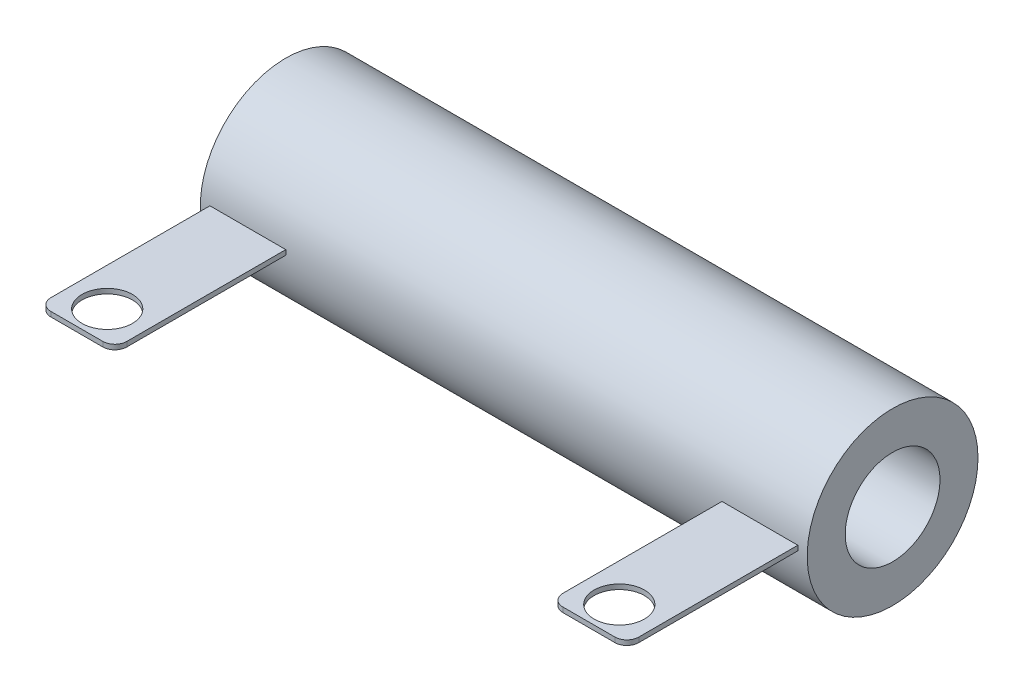
ISO-10303-21;
HEADER;
FILE_DESCRIPTION(('STEP AP214'),'2;1');
FILE_NAME('part.step','',(''),(''),'','','');
FILE_SCHEMA(('AUTOMOTIVE_DESIGN { 1 0 10303 214 1 1 1 1 }'));
ENDSEC;
DATA;
#1=APPLICATION_CONTEXT('core data for automotive mechanical design processes');
#2=APPLICATION_PROTOCOL_DEFINITION('international standard','automotive_design',2000,#1);
#3=PRODUCT_CONTEXT('',#1,'mechanical');
#4=PRODUCT('Part','Part','',(#3));
#5=PRODUCT_RELATED_PRODUCT_CATEGORY('part','',(#4));
#6=PRODUCT_DEFINITION_FORMATION('','',#4);
#7=PRODUCT_DEFINITION_CONTEXT('part definition',#1,'design');
#8=PRODUCT_DEFINITION('design','',#6,#7);
#9=PRODUCT_DEFINITION_SHAPE('','',#8);
#10=(LENGTH_UNIT() NAMED_UNIT(*) SI_UNIT(.MILLI.,.METRE.));
#11=(NAMED_UNIT(*) PLANE_ANGLE_UNIT() SI_UNIT($,.RADIAN.));
#12=(NAMED_UNIT(*) SI_UNIT($,.STERADIAN.) SOLID_ANGLE_UNIT());
#13=UNCERTAINTY_MEASURE_WITH_UNIT(LENGTH_MEASURE(1.E-05),#10,'distance_accuracy_value','');
#14=(GEOMETRIC_REPRESENTATION_CONTEXT(3) GLOBAL_UNCERTAINTY_ASSIGNED_CONTEXT((#13)) GLOBAL_UNIT_ASSIGNED_CONTEXT((#10,
#11,#12)) REPRESENTATION_CONTEXT('',''));
#15=CARTESIAN_POINT('',(0.,0.,0.));
#16=DIRECTION('',(0.,0.,1.));
#17=DIRECTION('',(1.,0.,0.));
#18=AXIS2_PLACEMENT_3D('',#15,#16,#17);
#19=CARTESIAN_POINT('',(23.606,0.407,20.45));
#20=DIRECTION('',(0.,-1.,0.));
#21=DIRECTION('',(0.,0.,-1.));
#22=AXIS2_PLACEMENT_3D('',#19,#20,#21);
#23=PLANE('',#22);
#24=CARTESIAN_POINT('',(23.606,0.407,20.45));
#25=DIRECTION('',(0.,1.,0.));
#26=DIRECTION('',(0.,0.,-1.));
#27=AXIS2_PLACEMENT_3D('',#24,#25,#26);
#28=CIRCLE('',#27,1.);
#29=CARTESIAN_POINT('',(23.606,0.407,21.45));
#30=VERTEX_POINT('',#29);
#31=CARTESIAN_POINT('',(24.606,0.407,20.45));
#32=VERTEX_POINT('',#31);
#33=EDGE_CURVE('E146',#30,#32,#28,.T.);
#34=ORIENTED_EDGE('',*,*,#33,.T.);
#35=DIRECTION('',(0.,0.,-1.));
#36=VECTOR('',#35,1.);
#37=CARTESIAN_POINT('',(24.606,0.407,5.19404127035727));
#38=LINE('',#37,#36);
#39=CARTESIAN_POINT('',(24.606,0.407,5.19404127035727));
#40=VERTEX_POINT('',#39);
#41=EDGE_CURVE('E104',#32,#40,#38,.T.);
#42=ORIENTED_EDGE('',*,*,#41,.T.);
#43=DIRECTION('',(-1.,0.,0.));
#44=VECTOR('',#43,1.);
#45=CARTESIAN_POINT('',(24.606,0.407,5.19404127035727));
#46=LINE('',#45,#44);
#47=CARTESIAN_POINT('',(18.256,0.407,5.19404127035727));
#48=VERTEX_POINT('',#47);
#49=EDGE_CURVE('E117',#40,#48,#46,.T.);
#50=ORIENTED_EDGE('',*,*,#49,.T.);
#51=DIRECTION('',(0.,0.,1.));
#52=VECTOR('',#51,1.);
#53=CARTESIAN_POINT('',(18.256,0.407,5.19404127035727));
#54=LINE('',#53,#52);
#55=CARTESIAN_POINT('',(18.256,0.407,20.45));
#56=VERTEX_POINT('',#55);
#57=EDGE_CURVE('E111',#48,#56,#54,.T.);
#58=ORIENTED_EDGE('',*,*,#57,.T.);
#59=CARTESIAN_POINT('',(19.256,0.407,20.45));
#60=DIRECTION('',(0.,1.,0.));
#61=DIRECTION('',(0.,0.,-1.));
#62=AXIS2_PLACEMENT_3D('',#59,#60,#61);
#63=CIRCLE('',#62,1.);
#64=CARTESIAN_POINT('',(19.256,0.407,21.45));
#65=VERTEX_POINT('',#64);
#66=EDGE_CURVE('E115',#56,#65,#63,.T.);
#67=ORIENTED_EDGE('',*,*,#66,.T.);
#68=DIRECTION('',(1.,0.,0.));
#69=VECTOR('',#68,1.);
#70=CARTESIAN_POINT('',(23.606,0.407,21.45));
#71=LINE('',#70,#69);
#72=EDGE_CURVE('E67',#65,#30,#71,.T.);
#73=ORIENTED_EDGE('',*,*,#72,.T.);
#74=EDGE_LOOP('',(#34,#42,#50,#58,#67,#73));
#75=FACE_BOUND('',#74,.T.);
#76=CARTESIAN_POINT('',(21.431,0.407,18.91));
#77=DIRECTION('',(0.,1.,0.));
#78=DIRECTION('',(0.,0.,-1.));
#79=AXIS2_PLACEMENT_3D('',#76,#77,#78);
#80=CIRCLE('',#79,2.1085);
#81=CARTESIAN_POINT('',(21.431,0.407,16.8015));
#82=VERTEX_POINT('',#81);
#83=EDGE_CURVE('E139',#82,#82,#80,.T.);
#84=ORIENTED_EDGE('',*,*,#83,.F.);
#85=EDGE_LOOP('',(#84));
#86=FACE_BOUND('',#85,.T.);
#87=ADVANCED_FACE('F50',(#75,#86),#23,.F.);
#88=CARTESIAN_POINT('',(23.606,0.,20.45));
#89=DIRECTION('',(0.,-1.,0.));
#90=DIRECTION('',(0.,0.,-1.));
#91=AXIS2_PLACEMENT_3D('',#88,#89,#90);
#92=PLANE('',#91);
#93=CARTESIAN_POINT('',(23.606,0.,20.45));
#94=DIRECTION('',(0.,1.,0.));
#95=DIRECTION('',(0.,0.,-1.));
#96=AXIS2_PLACEMENT_3D('',#93,#94,#95);
#97=CIRCLE('',#96,1.);
#98=CARTESIAN_POINT('',(23.606,0.,21.45));
#99=VERTEX_POINT('',#98);
#100=CARTESIAN_POINT('',(24.606,0.,20.45));
#101=VERTEX_POINT('',#100);
#102=EDGE_CURVE('E135',#99,#101,#97,.T.);
#103=ORIENTED_EDGE('',*,*,#102,.F.);
#104=DIRECTION('',(1.,0.,0.));
#105=VECTOR('',#104,1.);
#106=CARTESIAN_POINT('',(23.606,0.,21.45));
#107=LINE('',#106,#105);
#108=CARTESIAN_POINT('',(19.256,0.,21.45));
#109=VERTEX_POINT('',#108);
#110=EDGE_CURVE('E96',#109,#99,#107,.T.);
#111=ORIENTED_EDGE('',*,*,#110,.F.);
#112=CARTESIAN_POINT('',(19.256,0.,20.45));
#113=DIRECTION('',(0.,1.,0.));
#114=DIRECTION('',(0.,0.,-1.));
#115=AXIS2_PLACEMENT_3D('',#112,#113,#114);
#116=CIRCLE('',#115,1.);
#117=CARTESIAN_POINT('',(18.256,0.,20.45));
#118=VERTEX_POINT('',#117);
#119=EDGE_CURVE('E90',#118,#109,#116,.T.);
#120=ORIENTED_EDGE('',*,*,#119,.F.);
#121=DIRECTION('',(0.,0.,1.));
#122=VECTOR('',#121,1.);
#123=CARTESIAN_POINT('',(18.256,0.,5.19404127035727));
#124=LINE('',#123,#122);
#125=CARTESIAN_POINT('',(18.256,0.,5.19404127035727));
#126=VERTEX_POINT('',#125);
#127=EDGE_CURVE('E125',#126,#118,#124,.T.);
#128=ORIENTED_EDGE('',*,*,#127,.F.);
#129=DIRECTION('',(-1.,0.,0.));
#130=VECTOR('',#129,1.);
#131=CARTESIAN_POINT('',(24.606,0.,5.19404127035727));
#132=LINE('',#131,#130);
#133=CARTESIAN_POINT('',(24.606,0.,5.19404127035727));
#134=VERTEX_POINT('',#133);
#135=EDGE_CURVE('E141',#134,#126,#132,.T.);
#136=ORIENTED_EDGE('',*,*,#135,.F.);
#137=DIRECTION('',(0.,0.,-1.));
#138=VECTOR('',#137,1.);
#139=CARTESIAN_POINT('',(24.606,0.,5.19404127035727));
#140=LINE('',#139,#138);
#141=EDGE_CURVE('E138',#101,#134,#140,.T.);
#142=ORIENTED_EDGE('',*,*,#141,.F.);
#143=EDGE_LOOP('',(#103,#111,#120,#128,#136,#142));
#144=FACE_BOUND('',#143,.T.);
#145=CARTESIAN_POINT('',(21.431,0.,18.91));
#146=DIRECTION('',(0.,1.,0.));
#147=DIRECTION('',(0.,0.,-1.));
#148=AXIS2_PLACEMENT_3D('',#145,#146,#147);
#149=CIRCLE('',#148,2.1085);
#150=CARTESIAN_POINT('',(21.431,0.,16.8015));
#151=VERTEX_POINT('',#150);
#152=EDGE_CURVE('E239',#151,#151,#149,.T.);
#153=ORIENTED_EDGE('',*,*,#152,.T.);
#154=EDGE_LOOP('',(#153));
#155=FACE_BOUND('',#154,.T.);
#156=ADVANCED_FACE('F155',(#144,#155),#92,.T.);
#157=CARTESIAN_POINT('',(23.606,0.407,20.45));
#158=DIRECTION('',(0.,-1.,0.));
#159=DIRECTION('',(0.,0.,-1.));
#160=AXIS2_PLACEMENT_3D('',#157,#158,#159);
#161=CYLINDRICAL_SURFACE('',#160,1.);
#162=ORIENTED_EDGE('',*,*,#102,.T.);
#163=DIRECTION('',(0.,-1.,0.));
#164=VECTOR('',#163,1.);
#165=CARTESIAN_POINT('',(24.606,0.407,20.45));
#166=LINE('',#165,#164);
#167=EDGE_CURVE('E12',#32,#101,#166,.T.);
#168=ORIENTED_EDGE('',*,*,#167,.F.);
#169=ORIENTED_EDGE('',*,*,#33,.F.);
#170=DIRECTION('',(0.,-1.,0.));
#171=VECTOR('',#170,1.);
#172=CARTESIAN_POINT('',(23.606,0.407,21.45));
#173=LINE('',#172,#171);
#174=EDGE_CURVE('E131',#30,#99,#173,.T.);
#175=ORIENTED_EDGE('',*,*,#174,.T.);
#176=EDGE_LOOP('',(#162,#168,#169,#175));
#177=FACE_BOUND('',#176,.T.);
#178=ADVANCED_FACE('F52',(#177),#161,.T.);
#179=CARTESIAN_POINT('',(24.606,0.407,5.19404127035727));
#180=DIRECTION('',(-1.,0.,0.));
#181=DIRECTION('',(0.,0.,1.));
#182=AXIS2_PLACEMENT_3D('',#179,#180,#181);
#183=PLANE('',#182);
#184=ORIENTED_EDGE('',*,*,#141,.T.);
#185=DIRECTION('',(0.,-1.,0.));
#186=VECTOR('',#185,1.);
#187=CARTESIAN_POINT('',(24.606,0.407,5.19404127035727));
#188=LINE('',#187,#186);
#189=EDGE_CURVE('E59',#40,#134,#188,.T.);
#190=ORIENTED_EDGE('',*,*,#189,.F.);
#191=ORIENTED_EDGE('',*,*,#41,.F.);
#192=ORIENTED_EDGE('',*,*,#167,.T.);
#193=EDGE_LOOP('',(#184,#190,#191,#192));
#194=FACE_BOUND('',#193,.T.);
#195=ADVANCED_FACE('F180',(#194),#183,.F.);
#196=CARTESIAN_POINT('',(24.606,0.407,5.19404127035727));
#197=DIRECTION('',(0.,0.,1.));
#198=DIRECTION('',(1.,0.,0.));
#199=AXIS2_PLACEMENT_3D('',#196,#197,#198);
#200=PLANE('',#199);
#201=ORIENTED_EDGE('',*,*,#135,.T.);
#202=DIRECTION('',(0.,-1.,0.));
#203=VECTOR('',#202,1.);
#204=CARTESIAN_POINT('',(18.256,0.407,5.19404127035727));
#205=LINE('',#204,#203);
#206=EDGE_CURVE('E126',#48,#126,#205,.T.);
#207=ORIENTED_EDGE('',*,*,#206,.F.);
#208=ORIENTED_EDGE('',*,*,#49,.F.);
#209=ORIENTED_EDGE('',*,*,#189,.T.);
#210=EDGE_LOOP('',(#201,#207,#208,#209));
#211=FACE_BOUND('',#210,.T.);
#212=ADVANCED_FACE('F152',(#211),#200,.F.);
#213=CARTESIAN_POINT('',(18.256,0.407,5.19404127035727));
#214=DIRECTION('',(1.,0.,0.));
#215=DIRECTION('',(0.,0.,-1.));
#216=AXIS2_PLACEMENT_3D('',#213,#214,#215);
#217=PLANE('',#216);
#218=ORIENTED_EDGE('',*,*,#127,.T.);
#219=DIRECTION('',(0.,-1.,0.));
#220=VECTOR('',#219,1.);
#221=CARTESIAN_POINT('',(18.256,0.407,20.45));
#222=LINE('',#221,#220);
#223=EDGE_CURVE('E122',#56,#118,#222,.T.);
#224=ORIENTED_EDGE('',*,*,#223,.F.);
#225=ORIENTED_EDGE('',*,*,#57,.F.);
#226=ORIENTED_EDGE('',*,*,#206,.T.);
#227=EDGE_LOOP('',(#218,#224,#225,#226));
#228=FACE_BOUND('',#227,.T.);
#229=ADVANCED_FACE('F123',(#228),#217,.F.);
#230=CARTESIAN_POINT('',(19.256,0.407,20.45));
#231=DIRECTION('',(0.,-1.,0.));
#232=DIRECTION('',(0.,0.,-1.));
#233=AXIS2_PLACEMENT_3D('',#230,#231,#232);
#234=CYLINDRICAL_SURFACE('',#233,1.);
#235=ORIENTED_EDGE('',*,*,#119,.T.);
#236=DIRECTION('',(0.,-1.,0.));
#237=VECTOR('',#236,1.);
#238=CARTESIAN_POINT('',(19.256,0.407,21.45));
#239=LINE('',#238,#237);
#240=EDGE_CURVE('E127',#65,#109,#239,.T.);
#241=ORIENTED_EDGE('',*,*,#240,.F.);
#242=ORIENTED_EDGE('',*,*,#66,.F.);
#243=ORIENTED_EDGE('',*,*,#223,.T.);
#244=EDGE_LOOP('',(#235,#241,#242,#243));
#245=FACE_BOUND('',#244,.T.);
#246=ADVANCED_FACE('F129',(#245),#234,.T.);
#247=CARTESIAN_POINT('',(23.606,0.407,21.45));
#248=DIRECTION('',(0.,0.,-1.));
#249=DIRECTION('',(-1.,0.,0.));
#250=AXIS2_PLACEMENT_3D('',#247,#248,#249);
#251=PLANE('',#250);
#252=ORIENTED_EDGE('',*,*,#110,.T.);
#253=ORIENTED_EDGE('',*,*,#174,.F.);
#254=ORIENTED_EDGE('',*,*,#72,.F.);
#255=ORIENTED_EDGE('',*,*,#240,.T.);
#256=EDGE_LOOP('',(#252,#253,#254,#255));
#257=FACE_BOUND('',#256,.T.);
#258=ADVANCED_FACE('F160',(#257),#251,.F.);
#259=CARTESIAN_POINT('',(21.431,0.407,18.91));
#260=DIRECTION('',(0.,-1.,0.));
#261=DIRECTION('',(0.,0.,-1.));
#262=AXIS2_PLACEMENT_3D('',#259,#260,#261);
#263=CYLINDRICAL_SURFACE('',#262,2.1085);
#264=ORIENTED_EDGE('',*,*,#83,.T.);
#265=EDGE_LOOP('',(#264));
#266=FACE_BOUND('',#265,.T.);
#267=ORIENTED_EDGE('',*,*,#152,.F.);
#268=EDGE_LOOP('',(#267));
#269=FACE_BOUND('',#268,.T.);
#270=ADVANCED_FACE('F162',(#266,#269),#263,.F.);
#271=CLOSED_SHELL('',(#87,#156,#178,#195,#212,#229,#246,#258,#270));
#272=MANIFOLD_SOLID_BREP('B2',#271);
#273=CARTESIAN_POINT('',(-23.606,0.407,20.45));
#274=DIRECTION('',(0.,1.,0.));
#275=DIRECTION('',(0.,0.,1.));
#276=AXIS2_PLACEMENT_3D('',#273,#274,#275);
#277=PLANE('',#276);
#278=DIRECTION('',(0.,0.,1.));
#279=VECTOR('',#278,1.);
#280=CARTESIAN_POINT('',(-24.606,0.407,5.19404127035727));
#281=LINE('',#280,#279);
#282=CARTESIAN_POINT('',(-24.606,0.407,5.19404127035727));
#283=VERTEX_POINT('',#282);
#284=CARTESIAN_POINT('',(-24.606,0.407,20.45));
#285=VERTEX_POINT('',#284);
#286=EDGE_CURVE('E353',#283,#285,#281,.T.);
#287=ORIENTED_EDGE('',*,*,#286,.T.);
#288=CARTESIAN_POINT('',(-23.606,0.407,20.45));
#289=DIRECTION('',(0.,1.,0.));
#290=DIRECTION('',(0.,0.,1.));
#291=AXIS2_PLACEMENT_3D('',#288,#289,#290);
#292=CIRCLE('',#291,1.);
#293=CARTESIAN_POINT('',(-23.606,0.407,21.45));
#294=VERTEX_POINT('',#293);
#295=EDGE_CURVE('E308',#285,#294,#292,.T.);
#296=ORIENTED_EDGE('',*,*,#295,.T.);
#297=DIRECTION('',(1.,0.,0.));
#298=VECTOR('',#297,1.);
#299=CARTESIAN_POINT('',(-23.606,0.407,21.45));
#300=LINE('',#299,#298);
#301=CARTESIAN_POINT('',(-19.256,0.407,21.45));
#302=VERTEX_POINT('',#301);
#303=EDGE_CURVE('E321',#294,#302,#300,.T.);
#304=ORIENTED_EDGE('',*,*,#303,.T.);
#305=CARTESIAN_POINT('',(-19.256,0.407,20.45));
#306=DIRECTION('',(0.,1.,0.));
#307=DIRECTION('',(0.,0.,1.));
#308=AXIS2_PLACEMENT_3D('',#305,#306,#307);
#309=CIRCLE('',#308,1.);
#310=CARTESIAN_POINT('',(-18.256,0.407,20.45));
#311=VERTEX_POINT('',#310);
#312=EDGE_CURVE('E315',#302,#311,#309,.T.);
#313=ORIENTED_EDGE('',*,*,#312,.T.);
#314=DIRECTION('',(0.,0.,-1.));
#315=VECTOR('',#314,1.);
#316=CARTESIAN_POINT('',(-18.256,0.407,5.19404127035727));
#317=LINE('',#316,#315);
#318=CARTESIAN_POINT('',(-18.256,0.407,5.19404127035727));
#319=VERTEX_POINT('',#318);
#320=EDGE_CURVE('E319',#311,#319,#317,.T.);
#321=ORIENTED_EDGE('',*,*,#320,.T.);
#322=DIRECTION('',(-1.,0.,0.));
#323=VECTOR('',#322,1.);
#324=CARTESIAN_POINT('',(-24.606,0.407,5.19404127035727));
#325=LINE('',#324,#323);
#326=EDGE_CURVE('E271',#319,#283,#325,.T.);
#327=ORIENTED_EDGE('',*,*,#326,.T.);
#328=EDGE_LOOP('',(#287,#296,#304,#313,#321,#327));
#329=FACE_BOUND('',#328,.T.);
#330=CARTESIAN_POINT('',(-21.431,0.407,18.91));
#331=DIRECTION('',(0.,1.,0.));
#332=DIRECTION('',(0.,0.,1.));
#333=AXIS2_PLACEMENT_3D('',#330,#331,#332);
#334=CIRCLE('',#333,2.1085);
#335=CARTESIAN_POINT('',(-21.431,0.407,21.0185));
#336=VERTEX_POINT('',#335);
#337=EDGE_CURVE('E346',#336,#336,#334,.T.);
#338=ORIENTED_EDGE('',*,*,#337,.F.);
#339=EDGE_LOOP('',(#338));
#340=FACE_BOUND('',#339,.T.);
#341=ADVANCED_FACE('F254',(#329,#340),#277,.T.);
#342=CARTESIAN_POINT('',(-23.606,0.,20.45));
#343=DIRECTION('',(0.,1.,0.));
#344=DIRECTION('',(0.,0.,1.));
#345=AXIS2_PLACEMENT_3D('',#342,#343,#344);
#346=PLANE('',#345);
#347=DIRECTION('',(0.,0.,1.));
#348=VECTOR('',#347,1.);
#349=CARTESIAN_POINT('',(-24.606,0.,5.19404127035727));
#350=LINE('',#349,#348);
#351=CARTESIAN_POINT('',(-24.606,0.,5.19404127035727));
#352=VERTEX_POINT('',#351);
#353=CARTESIAN_POINT('',(-24.606,0.,20.45));
#354=VERTEX_POINT('',#353);
#355=EDGE_CURVE('E341',#352,#354,#350,.T.);
#356=ORIENTED_EDGE('',*,*,#355,.F.);
#357=DIRECTION('',(-1.,0.,0.));
#358=VECTOR('',#357,1.);
#359=CARTESIAN_POINT('',(-24.606,0.,5.19404127035727));
#360=LINE('',#359,#358);
#361=CARTESIAN_POINT('',(-18.256,0.,5.19404127035727));
#362=VERTEX_POINT('',#361);
#363=EDGE_CURVE('E300',#362,#352,#360,.T.);
#364=ORIENTED_EDGE('',*,*,#363,.F.);
#365=DIRECTION('',(0.,0.,-1.));
#366=VECTOR('',#365,1.);
#367=CARTESIAN_POINT('',(-18.256,0.,5.19404127035727));
#368=LINE('',#367,#366);
#369=CARTESIAN_POINT('',(-18.256,0.,20.45));
#370=VERTEX_POINT('',#369);
#371=EDGE_CURVE('E294',#370,#362,#368,.T.);
#372=ORIENTED_EDGE('',*,*,#371,.F.);
#373=CARTESIAN_POINT('',(-19.256,0.,20.45));
#374=DIRECTION('',(0.,1.,0.));
#375=DIRECTION('',(0.,0.,1.));
#376=AXIS2_PLACEMENT_3D('',#373,#374,#375);
#377=CIRCLE('',#376,1.);
#378=CARTESIAN_POINT('',(-19.256,0.,21.45));
#379=VERTEX_POINT('',#378);
#380=EDGE_CURVE('E329',#379,#370,#377,.T.);
#381=ORIENTED_EDGE('',*,*,#380,.F.);
#382=DIRECTION('',(1.,0.,0.));
#383=VECTOR('',#382,1.);
#384=CARTESIAN_POINT('',(-23.606,0.,21.45));
#385=LINE('',#384,#383);
#386=CARTESIAN_POINT('',(-23.606,0.,21.45));
#387=VERTEX_POINT('',#386);
#388=EDGE_CURVE('E348',#387,#379,#385,.T.);
#389=ORIENTED_EDGE('',*,*,#388,.F.);
#390=CARTESIAN_POINT('',(-23.606,0.,20.45));
#391=DIRECTION('',(0.,1.,0.));
#392=DIRECTION('',(0.,0.,1.));
#393=AXIS2_PLACEMENT_3D('',#390,#391,#392);
#394=CIRCLE('',#393,1.);
#395=EDGE_CURVE('E345',#354,#387,#394,.T.);
#396=ORIENTED_EDGE('',*,*,#395,.F.);
#397=EDGE_LOOP('',(#356,#364,#372,#381,#389,#396));
#398=FACE_BOUND('',#397,.T.);
#399=CARTESIAN_POINT('',(-21.431,0.,18.91));
#400=DIRECTION('',(0.,1.,0.));
#401=DIRECTION('',(0.,0.,1.));
#402=AXIS2_PLACEMENT_3D('',#399,#400,#401);
#403=CIRCLE('',#402,2.1085);
#404=CARTESIAN_POINT('',(-21.431,0.,21.0185));
#405=VERTEX_POINT('',#404);
#406=EDGE_CURVE('E449',#405,#405,#403,.T.);
#407=ORIENTED_EDGE('',*,*,#406,.T.);
#408=EDGE_LOOP('',(#407));
#409=FACE_BOUND('',#408,.T.);
#410=ADVANCED_FACE('F362',(#398,#409),#346,.F.);
#411=CARTESIAN_POINT('',(-24.606,0.407,5.19404127035727));
#412=DIRECTION('',(1.,0.,0.));
#413=DIRECTION('',(0.,0.,-1.));
#414=AXIS2_PLACEMENT_3D('',#411,#412,#413);
#415=PLANE('',#414);
#416=ORIENTED_EDGE('',*,*,#355,.T.);
#417=DIRECTION('',(0.,-1.,0.));
#418=VECTOR('',#417,1.);
#419=CARTESIAN_POINT('',(-24.606,0.407,20.45));
#420=LINE('',#419,#418);
#421=EDGE_CURVE('E48',#285,#354,#420,.T.);
#422=ORIENTED_EDGE('',*,*,#421,.F.);
#423=ORIENTED_EDGE('',*,*,#286,.F.);
#424=DIRECTION('',(0.,-1.,0.));
#425=VECTOR('',#424,1.);
#426=CARTESIAN_POINT('',(-24.606,0.407,5.19404127035727));
#427=LINE('',#426,#425);
#428=EDGE_CURVE('E337',#283,#352,#427,.T.);
#429=ORIENTED_EDGE('',*,*,#428,.T.);
#430=EDGE_LOOP('',(#416,#422,#423,#429));
#431=FACE_BOUND('',#430,.T.);
#432=ADVANCED_FACE('F256',(#431),#415,.F.);
#433=CARTESIAN_POINT('',(-23.606,0.407,20.45));
#434=DIRECTION('',(0.,-1.,0.));
#435=DIRECTION('',(0.,0.,-1.));
#436=AXIS2_PLACEMENT_3D('',#433,#434,#435);
#437=CYLINDRICAL_SURFACE('',#436,1.);
#438=ORIENTED_EDGE('',*,*,#395,.T.);
#439=DIRECTION('',(0.,-1.,0.));
#440=VECTOR('',#439,1.);
#441=CARTESIAN_POINT('',(-23.606,0.407,21.45));
#442=LINE('',#441,#440);
#443=EDGE_CURVE('E263',#294,#387,#442,.T.);
#444=ORIENTED_EDGE('',*,*,#443,.F.);
#445=ORIENTED_EDGE('',*,*,#295,.F.);
#446=ORIENTED_EDGE('',*,*,#421,.T.);
#447=EDGE_LOOP('',(#438,#444,#445,#446));
#448=FACE_BOUND('',#447,.T.);
#449=ADVANCED_FACE('F387',(#448),#437,.T.);
#450=CARTESIAN_POINT('',(-23.606,0.407,21.45));
#451=DIRECTION('',(0.,0.,-1.));
#452=DIRECTION('',(-1.,0.,0.));
#453=AXIS2_PLACEMENT_3D('',#450,#451,#452);
#454=PLANE('',#453);
#455=ORIENTED_EDGE('',*,*,#388,.T.);
#456=DIRECTION('',(0.,-1.,0.));
#457=VECTOR('',#456,1.);
#458=CARTESIAN_POINT('',(-19.256,0.407,21.45));
#459=LINE('',#458,#457);
#460=EDGE_CURVE('E330',#302,#379,#459,.T.);
#461=ORIENTED_EDGE('',*,*,#460,.F.);
#462=ORIENTED_EDGE('',*,*,#303,.F.);
#463=ORIENTED_EDGE('',*,*,#443,.T.);
#464=EDGE_LOOP('',(#455,#461,#462,#463));
#465=FACE_BOUND('',#464,.T.);
#466=ADVANCED_FACE('F359',(#465),#454,.F.);
#467=CARTESIAN_POINT('',(-19.256,0.407,20.45));
#468=DIRECTION('',(0.,-1.,0.));
#469=DIRECTION('',(0.,0.,-1.));
#470=AXIS2_PLACEMENT_3D('',#467,#468,#469);
#471=CYLINDRICAL_SURFACE('',#470,1.);
#472=ORIENTED_EDGE('',*,*,#380,.T.);
#473=DIRECTION('',(0.,-1.,0.));
#474=VECTOR('',#473,1.);
#475=CARTESIAN_POINT('',(-18.256,0.407,20.45));
#476=LINE('',#475,#474);
#477=EDGE_CURVE('E326',#311,#370,#476,.T.);
#478=ORIENTED_EDGE('',*,*,#477,.F.);
#479=ORIENTED_EDGE('',*,*,#312,.F.);
#480=ORIENTED_EDGE('',*,*,#460,.T.);
#481=EDGE_LOOP('',(#472,#478,#479,#480));
#482=FACE_BOUND('',#481,.T.);
#483=ADVANCED_FACE('F327',(#482),#471,.T.);
#484=CARTESIAN_POINT('',(-18.256,0.407,5.19404127035727));
#485=DIRECTION('',(-1.,0.,0.));
#486=DIRECTION('',(0.,0.,1.));
#487=AXIS2_PLACEMENT_3D('',#484,#485,#486);
#488=PLANE('',#487);
#489=ORIENTED_EDGE('',*,*,#371,.T.);
#490=DIRECTION('',(0.,-1.,0.));
#491=VECTOR('',#490,1.);
#492=CARTESIAN_POINT('',(-18.256,0.407,5.19404127035727));
#493=LINE('',#492,#491);
#494=EDGE_CURVE('E331',#319,#362,#493,.T.);
#495=ORIENTED_EDGE('',*,*,#494,.F.);
#496=ORIENTED_EDGE('',*,*,#320,.F.);
#497=ORIENTED_EDGE('',*,*,#477,.T.);
#498=EDGE_LOOP('',(#489,#495,#496,#497));
#499=FACE_BOUND('',#498,.T.);
#500=ADVANCED_FACE('F333',(#499),#488,.F.);
#501=CARTESIAN_POINT('',(-24.606,0.407,5.19404127035727));
#502=DIRECTION('',(0.,0.,1.));
#503=DIRECTION('',(1.,0.,0.));
#504=AXIS2_PLACEMENT_3D('',#501,#502,#503);
#505=PLANE('',#504);
#506=ORIENTED_EDGE('',*,*,#363,.T.);
#507=ORIENTED_EDGE('',*,*,#428,.F.);
#508=ORIENTED_EDGE('',*,*,#326,.F.);
#509=ORIENTED_EDGE('',*,*,#494,.T.);
#510=EDGE_LOOP('',(#506,#507,#508,#509));
#511=FACE_BOUND('',#510,.T.);
#512=ADVANCED_FACE('F367',(#511),#505,.F.);
#513=CARTESIAN_POINT('',(-21.431,0.407,18.91));
#514=DIRECTION('',(0.,-1.,0.));
#515=DIRECTION('',(0.,0.,-1.));
#516=AXIS2_PLACEMENT_3D('',#513,#514,#515);
#517=CYLINDRICAL_SURFACE('',#516,2.1085);
#518=ORIENTED_EDGE('',*,*,#337,.T.);
#519=EDGE_LOOP('',(#518));
#520=FACE_BOUND('',#519,.T.);
#521=ORIENTED_EDGE('',*,*,#406,.F.);
#522=EDGE_LOOP('',(#521));
#523=FACE_BOUND('',#522,.T.);
#524=ADVANCED_FACE('F369',(#520,#523),#517,.F.);
#525=CLOSED_SHELL('',(#341,#410,#432,#449,#466,#483,#500,#512,#524));
#526=MANIFOLD_SOLID_BREP('B6',#525);
#527=CARTESIAN_POINT('',(25.4,0.,0.));
#528=DIRECTION('',(1.,0.,0.));
#529=DIRECTION('',(0.,0.,-1.));
#530=AXIS2_PLACEMENT_3D('',#527,#528,#529);
#531=PLANE('',#530);
#532=CARTESIAN_POINT('',(25.4,0.,0.));
#533=DIRECTION('',(1.,0.,0.));
#534=DIRECTION('',(0.,0.,-1.));
#535=AXIS2_PLACEMENT_3D('',#532,#533,#534);
#536=CIRCLE('',#535,7.15);
#537=CARTESIAN_POINT('',(25.4,0.,-7.15));
#538=VERTEX_POINT('',#537);
#539=EDGE_CURVE('E253',#538,#538,#536,.T.);
#540=ORIENTED_EDGE('',*,*,#539,.T.);
#541=EDGE_LOOP('',(#540));
#542=FACE_BOUND('',#541,.T.);
#543=CARTESIAN_POINT('',(25.4,0.,0.));
#544=DIRECTION('',(1.,0.,0.));
#545=DIRECTION('',(0.,0.,-1.));
#546=AXIS2_PLACEMENT_3D('',#543,#544,#545);
#547=CIRCLE('',#546,3.97);
#548=CARTESIAN_POINT('',(25.4,0.,-3.97));
#549=VERTEX_POINT('',#548);
#550=EDGE_CURVE('E469',#549,#549,#547,.T.);
#551=ORIENTED_EDGE('',*,*,#550,.F.);
#552=EDGE_LOOP('',(#551));
#553=FACE_BOUND('',#552,.T.);
#554=ADVANCED_FACE('F458',(#542,#553),#531,.T.);
#555=CARTESIAN_POINT('',(-25.4,0.,0.));
#556=DIRECTION('',(1.,0.,0.));
#557=DIRECTION('',(0.,0.,-1.));
#558=AXIS2_PLACEMENT_3D('',#555,#556,#557);
#559=PLANE('',#558);
#560=CARTESIAN_POINT('',(-25.4,0.,0.));
#561=DIRECTION('',(1.,0.,0.));
#562=DIRECTION('',(0.,0.,-1.));
#563=AXIS2_PLACEMENT_3D('',#560,#561,#562);
#564=CIRCLE('',#563,7.15);
#565=CARTESIAN_POINT('',(-25.4,0.,-7.15));
#566=VERTEX_POINT('',#565);
#567=EDGE_CURVE('E462',#566,#566,#564,.T.);
#568=ORIENTED_EDGE('',*,*,#567,.F.);
#569=EDGE_LOOP('',(#568));
#570=FACE_BOUND('',#569,.T.);
#571=CARTESIAN_POINT('',(-25.4,0.,0.));
#572=DIRECTION('',(1.,0.,0.));
#573=DIRECTION('',(0.,0.,-1.));
#574=AXIS2_PLACEMENT_3D('',#571,#572,#573);
#575=CIRCLE('',#574,3.97);
#576=CARTESIAN_POINT('',(-25.4,0.,-3.97));
#577=VERTEX_POINT('',#576);
#578=EDGE_CURVE('E471',#577,#577,#575,.T.);
#579=ORIENTED_EDGE('',*,*,#578,.T.);
#580=EDGE_LOOP('',(#579));
#581=FACE_BOUND('',#580,.T.);
#582=ADVANCED_FACE('F481',(#570,#581),#559,.F.);
#583=CARTESIAN_POINT('',(25.4,0.,0.));
#584=DIRECTION('',(-1.,0.,0.));
#585=DIRECTION('',(0.,0.,1.));
#586=AXIS2_PLACEMENT_3D('',#583,#584,#585);
#587=CYLINDRICAL_SURFACE('',#586,7.15);
#588=ORIENTED_EDGE('',*,*,#539,.F.);
#589=EDGE_LOOP('',(#588));
#590=FACE_BOUND('',#589,.T.);
#591=ORIENTED_EDGE('',*,*,#567,.T.);
#592=EDGE_LOOP('',(#591));
#593=FACE_BOUND('',#592,.T.);
#594=ADVANCED_FACE('F460',(#590,#593),#587,.T.);
#595=CARTESIAN_POINT('',(25.4,0.,0.));
#596=DIRECTION('',(-1.,0.,0.));
#597=DIRECTION('',(0.,0.,1.));
#598=AXIS2_PLACEMENT_3D('',#595,#596,#597);
#599=CYLINDRICAL_SURFACE('',#598,3.97);
#600=ORIENTED_EDGE('',*,*,#550,.T.);
#601=EDGE_LOOP('',(#600));
#602=FACE_BOUND('',#601,.T.);
#603=ORIENTED_EDGE('',*,*,#578,.F.);
#604=EDGE_LOOP('',(#603));
#605=FACE_BOUND('',#604,.T.);
#606=ADVANCED_FACE('F477',(#602,#605),#599,.F.);
#607=CLOSED_SHELL('',(#554,#582,#594,#606));
#608=MANIFOLD_SOLID_BREP('B42',#607);
#609=ADVANCED_BREP_SHAPE_REPRESENTATION('',(#18,#272,#526,#608),#14);
#610=SHAPE_DEFINITION_REPRESENTATION(#9,#609);
ENDSEC;
END-ISO-10303-21;
